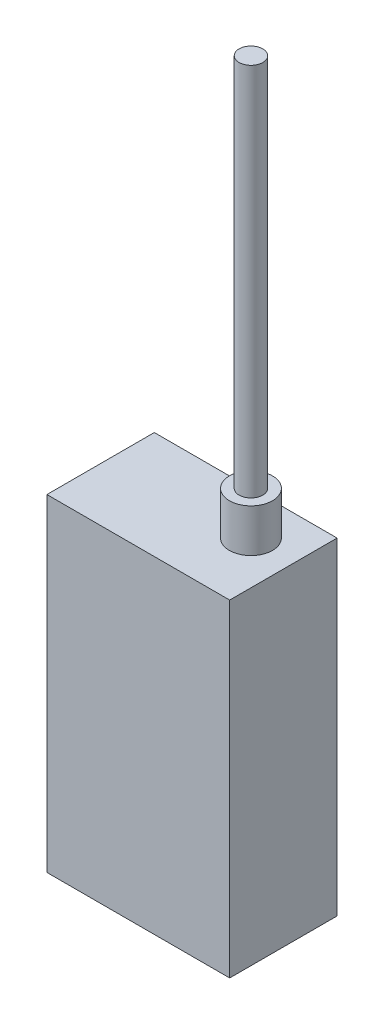
ISO-10303-21;
HEADER;
FILE_DESCRIPTION(('STEP AP214'),'2;1');
FILE_NAME('part.step','',(''),(''),'','','');
FILE_SCHEMA(('AUTOMOTIVE_DESIGN { 1 0 10303 214 1 1 1 1 }'));
ENDSEC;
DATA;
#1=APPLICATION_CONTEXT('core data for automotive mechanical design processes');
#2=APPLICATION_PROTOCOL_DEFINITION('international standard','automotive_design',2000,#1);
#3=PRODUCT_CONTEXT('',#1,'mechanical');
#4=PRODUCT('Part','Part','',(#3));
#5=PRODUCT_RELATED_PRODUCT_CATEGORY('part','',(#4));
#6=PRODUCT_DEFINITION_FORMATION('','',#4);
#7=PRODUCT_DEFINITION_CONTEXT('part definition',#1,'design');
#8=PRODUCT_DEFINITION('design','',#6,#7);
#9=PRODUCT_DEFINITION_SHAPE('','',#8);
#10=(LENGTH_UNIT() NAMED_UNIT(*) SI_UNIT(.MILLI.,.METRE.));
#11=(NAMED_UNIT(*) PLANE_ANGLE_UNIT() SI_UNIT($,.RADIAN.));
#12=(NAMED_UNIT(*) SI_UNIT($,.STERADIAN.) SOLID_ANGLE_UNIT());
#13=UNCERTAINTY_MEASURE_WITH_UNIT(LENGTH_MEASURE(1.E-05),#10,'distance_accuracy_value','');
#14=(GEOMETRIC_REPRESENTATION_CONTEXT(3) GLOBAL_UNCERTAINTY_ASSIGNED_CONTEXT((#13)) GLOBAL_UNIT_ASSIGNED_CONTEXT((#10,
#11,#12)) REPRESENTATION_CONTEXT('',''));
#15=CARTESIAN_POINT('',(0.,0.,0.));
#16=DIRECTION('',(0.,0.,1.));
#17=DIRECTION('',(1.,0.,0.));
#18=AXIS2_PLACEMENT_3D('',#15,#16,#17);
#19=CARTESIAN_POINT('',(-26.9494,-48.26,31.6738));
#20=DIRECTION('',(1.,0.,0.));
#21=DIRECTION('',(0.,0.,-1.));
#22=AXIS2_PLACEMENT_3D('',#19,#20,#21);
#23=PLANE('',#22);
#24=DIRECTION('',(0.,-1.,0.));
#25=VECTOR('',#24,1.);
#26=CARTESIAN_POINT('',(-26.9494,-48.26,0.));
#27=LINE('',#26,#25);
#28=CARTESIAN_POINT('',(-26.9494,48.26,0.));
#29=VERTEX_POINT('',#28);
#30=CARTESIAN_POINT('',(-26.9494,-48.26,0.));
#31=VERTEX_POINT('',#30);
#32=EDGE_CURVE('E103',#29,#31,#27,.T.);
#33=ORIENTED_EDGE('',*,*,#32,.T.);
#34=DIRECTION('',(0.,0.,-1.));
#35=VECTOR('',#34,1.);
#36=CARTESIAN_POINT('',(-26.9494,-48.26,31.6738));
#37=LINE('',#36,#35);
#38=CARTESIAN_POINT('',(-26.9494,-48.26,31.6738));
#39=VERTEX_POINT('',#38);
#40=EDGE_CURVE('E45',#39,#31,#37,.T.);
#41=ORIENTED_EDGE('',*,*,#40,.F.);
#42=DIRECTION('',(0.,-1.,0.));
#43=VECTOR('',#42,1.);
#44=CARTESIAN_POINT('',(-26.9494,-48.26,31.6738));
#45=LINE('',#44,#43);
#46=CARTESIAN_POINT('',(-26.9494,48.26,31.6738));
#47=VERTEX_POINT('',#46);
#48=EDGE_CURVE('E89',#47,#39,#45,.T.);
#49=ORIENTED_EDGE('',*,*,#48,.F.);
#50=DIRECTION('',(0.,0.,-1.));
#51=VECTOR('',#50,1.);
#52=CARTESIAN_POINT('',(-26.9494,48.26,31.6738));
#53=LINE('',#52,#51);
#54=EDGE_CURVE('E99',#47,#29,#53,.T.);
#55=ORIENTED_EDGE('',*,*,#54,.T.);
#56=EDGE_LOOP('',(#33,#41,#49,#55));
#57=FACE_BOUND('',#56,.T.);
#58=ADVANCED_FACE('F37',(#57),#23,.F.);
#59=CARTESIAN_POINT('',(26.9494,-48.26,31.6738));
#60=DIRECTION('',(0.,1.,0.));
#61=DIRECTION('',(-1.,0.,0.));
#62=AXIS2_PLACEMENT_3D('',#59,#60,#61);
#63=PLANE('',#62);
#64=DIRECTION('',(1.,0.,0.));
#65=VECTOR('',#64,1.);
#66=CARTESIAN_POINT('',(26.9494,-48.26,0.));
#67=LINE('',#66,#65);
#68=CARTESIAN_POINT('',(26.9494,-48.26,0.));
#69=VERTEX_POINT('',#68);
#70=EDGE_CURVE('E94',#31,#69,#67,.T.);
#71=ORIENTED_EDGE('',*,*,#70,.T.);
#72=DIRECTION('',(0.,0.,-1.));
#73=VECTOR('',#72,1.);
#74=CARTESIAN_POINT('',(26.9494,-48.26,31.6738));
#75=LINE('',#74,#73);
#76=CARTESIAN_POINT('',(26.9494,-48.26,31.6738));
#77=VERTEX_POINT('',#76);
#78=EDGE_CURVE('E92',#77,#69,#75,.T.);
#79=ORIENTED_EDGE('',*,*,#78,.F.);
#80=DIRECTION('',(1.,0.,0.));
#81=VECTOR('',#80,1.);
#82=CARTESIAN_POINT('',(26.9494,-48.26,31.6738));
#83=LINE('',#82,#81);
#84=EDGE_CURVE('E84',#39,#77,#83,.T.);
#85=ORIENTED_EDGE('',*,*,#84,.F.);
#86=ORIENTED_EDGE('',*,*,#40,.T.);
#87=EDGE_LOOP('',(#71,#79,#85,#86));
#88=FACE_BOUND('',#87,.T.);
#89=ADVANCED_FACE('F93',(#88),#63,.F.);
#90=CARTESIAN_POINT('',(26.9494,-48.26,31.6738));
#91=DIRECTION('',(-1.,0.,0.));
#92=DIRECTION('',(0.,0.,1.));
#93=AXIS2_PLACEMENT_3D('',#90,#91,#92);
#94=PLANE('',#93);
#95=DIRECTION('',(0.,1.,0.));
#96=VECTOR('',#95,1.);
#97=CARTESIAN_POINT('',(26.9494,-48.26,0.));
#98=LINE('',#97,#96);
#99=CARTESIAN_POINT('',(26.9494,48.26,0.));
#100=VERTEX_POINT('',#99);
#101=EDGE_CURVE('E70',#69,#100,#98,.T.);
#102=ORIENTED_EDGE('',*,*,#101,.T.);
#103=DIRECTION('',(0.,0.,-1.));
#104=VECTOR('',#103,1.);
#105=CARTESIAN_POINT('',(26.9494,48.26,31.6738));
#106=LINE('',#105,#104);
#107=CARTESIAN_POINT('',(26.9494,48.26,31.6738));
#108=VERTEX_POINT('',#107);
#109=EDGE_CURVE('E95',#108,#100,#106,.T.);
#110=ORIENTED_EDGE('',*,*,#109,.F.);
#111=DIRECTION('',(0.,1.,0.));
#112=VECTOR('',#111,1.);
#113=CARTESIAN_POINT('',(26.9494,-48.26,31.6738));
#114=LINE('',#113,#112);
#115=EDGE_CURVE('E87',#77,#108,#114,.T.);
#116=ORIENTED_EDGE('',*,*,#115,.F.);
#117=ORIENTED_EDGE('',*,*,#78,.T.);
#118=EDGE_LOOP('',(#102,#110,#116,#117));
#119=FACE_BOUND('',#118,.T.);
#120=ADVANCED_FACE('F97',(#119),#94,.F.);
#121=CARTESIAN_POINT('',(26.9494,48.26,31.6738));
#122=DIRECTION('',(0.,-1.,0.));
#123=DIRECTION('',(0.,0.,-1.));
#124=AXIS2_PLACEMENT_3D('',#121,#122,#123);
#125=PLANE('',#124);
#126=CARTESIAN_POINT('',(14.2494,48.26,12.7));
#127=DIRECTION('',(0.,-1.,0.));
#128=DIRECTION('',(0.,0.,-1.));
#129=AXIS2_PLACEMENT_3D('',#126,#127,#128);
#130=CIRCLE('',#129,6.35);
#131=CARTESIAN_POINT('',(14.2494,48.26,6.35));
#132=VERTEX_POINT('',#131);
#133=EDGE_CURVE('E11',#132,#132,#130,.F.);
#134=ORIENTED_EDGE('',*,*,#133,.F.);
#135=EDGE_LOOP('',(#134));
#136=FACE_BOUND('',#135,.T.);
#137=DIRECTION('',(-1.,0.,0.));
#138=VECTOR('',#137,1.);
#139=CARTESIAN_POINT('',(26.9494,48.26,0.));
#140=LINE('',#139,#138);
#141=EDGE_CURVE('E76',#100,#29,#140,.T.);
#142=ORIENTED_EDGE('',*,*,#141,.T.);
#143=ORIENTED_EDGE('',*,*,#54,.F.);
#144=DIRECTION('',(-1.,0.,0.));
#145=VECTOR('',#144,1.);
#146=CARTESIAN_POINT('',(26.9494,48.26,31.6738));
#147=LINE('',#146,#145);
#148=EDGE_CURVE('E53',#108,#47,#147,.T.);
#149=ORIENTED_EDGE('',*,*,#148,.F.);
#150=ORIENTED_EDGE('',*,*,#109,.T.);
#151=EDGE_LOOP('',(#142,#143,#149,#150));
#152=FACE_BOUND('',#151,.T.);
#153=ADVANCED_FACE('F125',(#136,#152),#125,.F.);
#154=CARTESIAN_POINT('',(0.,0.,31.6738));
#155=DIRECTION('',(0.,0.,1.));
#156=DIRECTION('',(1.,0.,0.));
#157=AXIS2_PLACEMENT_3D('',#154,#155,#156);
#158=PLANE('',#157);
#159=ORIENTED_EDGE('',*,*,#48,.T.);
#160=ORIENTED_EDGE('',*,*,#84,.T.);
#161=ORIENTED_EDGE('',*,*,#115,.T.);
#162=ORIENTED_EDGE('',*,*,#148,.T.);
#163=EDGE_LOOP('',(#159,#160,#161,#162));
#164=FACE_BOUND('',#163,.T.);
#165=ADVANCED_FACE('F85',(#164),#158,.T.);
#166=CARTESIAN_POINT('',(0.,0.,0.));
#167=DIRECTION('',(0.,0.,1.));
#168=DIRECTION('',(1.,0.,0.));
#169=AXIS2_PLACEMENT_3D('',#166,#167,#168);
#170=PLANE('',#169);
#171=ORIENTED_EDGE('',*,*,#32,.F.);
#172=ORIENTED_EDGE('',*,*,#141,.F.);
#173=ORIENTED_EDGE('',*,*,#101,.F.);
#174=ORIENTED_EDGE('',*,*,#70,.F.);
#175=EDGE_LOOP('',(#171,#172,#173,#174));
#176=FACE_BOUND('',#175,.T.);
#177=ADVANCED_FACE('F114',(#176),#170,.F.);
#178=CARTESIAN_POINT('',(14.2494,60.96,12.7));
#179=DIRECTION('',(0.,-1.,0.));
#180=DIRECTION('',(0.,0.,-1.));
#181=AXIS2_PLACEMENT_3D('',#178,#179,#180);
#182=CYLINDRICAL_SURFACE('',#181,6.35);
#183=CARTESIAN_POINT('',(14.2494,60.96,12.7));
#184=DIRECTION('',(0.,1.,0.));
#185=DIRECTION('',(0.,0.,1.));
#186=AXIS2_PLACEMENT_3D('',#183,#184,#185);
#187=CIRCLE('',#186,6.35);
#188=CARTESIAN_POINT('',(14.2494,60.96,19.05));
#189=VERTEX_POINT('',#188);
#190=EDGE_CURVE('E106',#189,#189,#187,.T.);
#191=ORIENTED_EDGE('',*,*,#190,.F.);
#192=EDGE_LOOP('',(#191));
#193=FACE_BOUND('',#192,.T.);
#194=ORIENTED_EDGE('',*,*,#133,.T.);
#195=EDGE_LOOP('',(#194));
#196=FACE_BOUND('',#195,.T.);
#197=ADVANCED_FACE('F116',(#193,#196),#182,.T.);
#198=CARTESIAN_POINT('',(14.2494,60.96,12.7));
#199=DIRECTION('',(0.,1.,0.));
#200=DIRECTION('',(0.,0.,1.));
#201=AXIS2_PLACEMENT_3D('',#198,#199,#200);
#202=PLANE('',#201);
#203=CARTESIAN_POINT('',(14.2494,60.96,12.7));
#204=DIRECTION('',(0.,1.,0.));
#205=DIRECTION('',(0.,0.,1.));
#206=AXIS2_PLACEMENT_3D('',#203,#204,#205);
#207=CIRCLE('',#206,3.4925);
#208=CARTESIAN_POINT('',(14.2494,60.96,16.1925));
#209=VERTEX_POINT('',#208);
#210=EDGE_CURVE('E196',#209,#209,#207,.T.);
#211=ORIENTED_EDGE('',*,*,#210,.F.);
#212=EDGE_LOOP('',(#211));
#213=FACE_BOUND('',#212,.T.);
#214=ORIENTED_EDGE('',*,*,#190,.T.);
#215=EDGE_LOOP('',(#214));
#216=FACE_BOUND('',#215,.T.);
#217=ADVANCED_FACE('F122',(#213,#216),#202,.T.);
#218=CARTESIAN_POINT('',(14.2494,171.45,12.7));
#219=DIRECTION('',(0.,-1.,0.));
#220=DIRECTION('',(0.,0.,-1.));
#221=AXIS2_PLACEMENT_3D('',#218,#219,#220);
#222=CYLINDRICAL_SURFACE('',#221,3.4925);
#223=CARTESIAN_POINT('',(14.2494,171.45,12.7));
#224=DIRECTION('',(0.,1.,0.));
#225=DIRECTION('',(0.,0.,1.));
#226=AXIS2_PLACEMENT_3D('',#223,#224,#225);
#227=CIRCLE('',#226,3.4925);
#228=CARTESIAN_POINT('',(14.2494,171.45,16.1925));
#229=VERTEX_POINT('',#228);
#230=EDGE_CURVE('E195',#229,#229,#227,.T.);
#231=ORIENTED_EDGE('',*,*,#230,.F.);
#232=EDGE_LOOP('',(#231));
#233=FACE_BOUND('',#232,.T.);
#234=ORIENTED_EDGE('',*,*,#210,.T.);
#235=EDGE_LOOP('',(#234));
#236=FACE_BOUND('',#235,.T.);
#237=ADVANCED_FACE('F169',(#233,#236),#222,.T.);
#238=CARTESIAN_POINT('',(14.2494,171.45,12.7));
#239=DIRECTION('',(0.,1.,0.));
#240=DIRECTION('',(0.,0.,1.));
#241=AXIS2_PLACEMENT_3D('',#238,#239,#240);
#242=PLANE('',#241);
#243=ORIENTED_EDGE('',*,*,#230,.T.);
#244=EDGE_LOOP('',(#243));
#245=FACE_BOUND('',#244,.T.);
#246=ADVANCED_FACE('F178',(#245),#242,.T.);
#247=CLOSED_SHELL('',(#58,#89,#120,#153,#165,#177,#197,#217,#237,#246));
#248=MANIFOLD_SOLID_BREP('B2',#247);
#249=ADVANCED_BREP_SHAPE_REPRESENTATION('',(#18,#248),#14);
#250=SHAPE_DEFINITION_REPRESENTATION(#9,#249);
ENDSEC;
END-ISO-10303-21;
